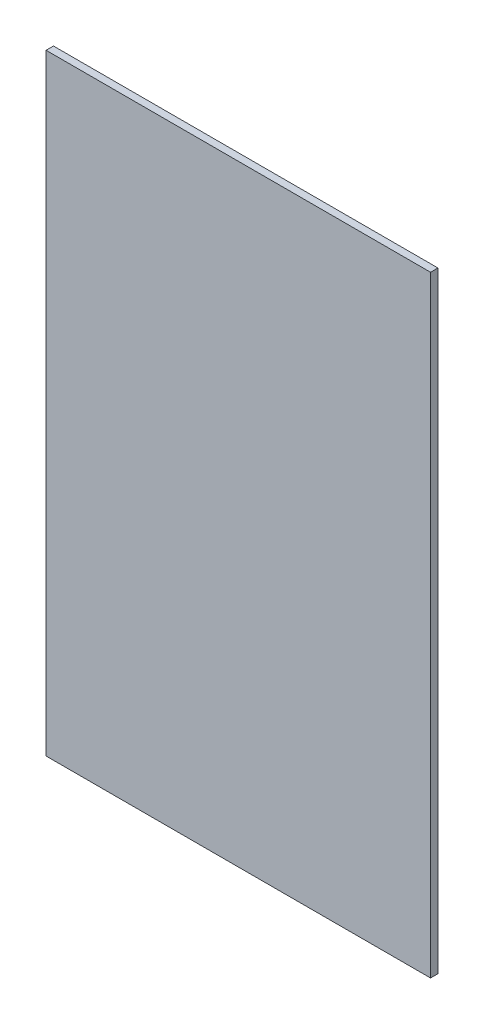
ISO-10303-21;
HEADER;
FILE_DESCRIPTION(('STEP AP214'),'2;1');
FILE_NAME('part.step','',(''),(''),'','','');
FILE_SCHEMA(('AUTOMOTIVE_DESIGN { 1 0 10303 214 1 1 1 1 }'));
ENDSEC;
DATA;
#1=APPLICATION_CONTEXT('core data for automotive mechanical design processes');
#2=APPLICATION_PROTOCOL_DEFINITION('international standard','automotive_design',2000,#1);
#3=PRODUCT_CONTEXT('',#1,'mechanical');
#4=PRODUCT('Part','Part','',(#3));
#5=PRODUCT_RELATED_PRODUCT_CATEGORY('part','',(#4));
#6=PRODUCT_DEFINITION_FORMATION('','',#4);
#7=PRODUCT_DEFINITION_CONTEXT('part definition',#1,'design');
#8=PRODUCT_DEFINITION('design','',#6,#7);
#9=PRODUCT_DEFINITION_SHAPE('','',#8);
#10=(LENGTH_UNIT() NAMED_UNIT(*) SI_UNIT(.MILLI.,.METRE.));
#11=(NAMED_UNIT(*) PLANE_ANGLE_UNIT() SI_UNIT($,.RADIAN.));
#12=(NAMED_UNIT(*) SI_UNIT($,.STERADIAN.) SOLID_ANGLE_UNIT());
#13=UNCERTAINTY_MEASURE_WITH_UNIT(LENGTH_MEASURE(1.E-05),#10,'distance_accuracy_value','');
#14=(GEOMETRIC_REPRESENTATION_CONTEXT(3) GLOBAL_UNCERTAINTY_ASSIGNED_CONTEXT((#13)) GLOBAL_UNIT_ASSIGNED_CONTEXT((#10,
#11,#12)) REPRESENTATION_CONTEXT('',''));
#15=CARTESIAN_POINT('',(0.,0.,0.));
#16=DIRECTION('',(0.,0.,1.));
#17=DIRECTION('',(1.,0.,0.));
#18=AXIS2_PLACEMENT_3D('',#15,#16,#17);
#19=CARTESIAN_POINT('',(0.917030567685551,196.493449781659,3.));
#20=DIRECTION('',(1.,0.,0.));
#21=DIRECTION('',(0.,1.,0.));
#22=AXIS2_PLACEMENT_3D('',#19,#20,#21);
#23=PLANE('',#22);
#24=DIRECTION('',(0.,-1.,0.));
#25=VECTOR('',#24,1.);
#26=CARTESIAN_POINT('',(0.917030567685551,196.493449781659,0.));
#27=LINE('',#26,#25);
#28=CARTESIAN_POINT('',(0.917030567685551,196.493449781659,0.));
#29=VERTEX_POINT('',#28);
#30=CARTESIAN_POINT('',(0.917030567685609,-51.5065502183406,0.));
#31=VERTEX_POINT('',#30);
#32=EDGE_CURVE('E98',#29,#31,#27,.T.);
#33=ORIENTED_EDGE('',*,*,#32,.T.);
#34=DIRECTION('',(0.,0.,-1.));
#35=VECTOR('',#34,1.);
#36=CARTESIAN_POINT('',(0.917030567685609,-51.5065502183406,3.));
#37=LINE('',#36,#35);
#38=CARTESIAN_POINT('',(0.917030567685609,-51.5065502183406,3.));
#39=VERTEX_POINT('',#38);
#40=EDGE_CURVE('E11',#39,#31,#37,.T.);
#41=ORIENTED_EDGE('',*,*,#40,.F.);
#42=DIRECTION('',(0.,-1.,0.));
#43=VECTOR('',#42,1.);
#44=CARTESIAN_POINT('',(0.917030567685551,196.493449781659,3.));
#45=LINE('',#44,#43);
#46=CARTESIAN_POINT('',(0.917030567685551,196.493449781659,3.));
#47=VERTEX_POINT('',#46);
#48=EDGE_CURVE('E86',#47,#39,#45,.T.);
#49=ORIENTED_EDGE('',*,*,#48,.F.);
#50=DIRECTION('',(0.,0.,-1.));
#51=VECTOR('',#50,1.);
#52=CARTESIAN_POINT('',(0.917030567685551,196.493449781659,3.));
#53=LINE('',#52,#51);
#54=EDGE_CURVE('E94',#47,#29,#53,.T.);
#55=ORIENTED_EDGE('',*,*,#54,.T.);
#56=EDGE_LOOP('',(#33,#41,#49,#55));
#57=FACE_BOUND('',#56,.T.);
#58=ADVANCED_FACE('F35',(#57),#23,.F.);
#59=CARTESIAN_POINT('',(0.917030567685609,-51.5065502183406,3.));
#60=DIRECTION('',(0.,1.,0.));
#61=DIRECTION('',(0.,0.,1.));
#62=AXIS2_PLACEMENT_3D('',#59,#60,#61);
#63=PLANE('',#62);
#64=DIRECTION('',(1.,0.,0.));
#65=VECTOR('',#64,1.);
#66=CARTESIAN_POINT('',(0.917030567685609,-51.5065502183406,0.));
#67=LINE('',#66,#65);
#68=CARTESIAN_POINT('',(156.917030567686,-51.5065502183406,0.));
#69=VERTEX_POINT('',#68);
#70=EDGE_CURVE('E90',#31,#69,#67,.T.);
#71=ORIENTED_EDGE('',*,*,#70,.T.);
#72=DIRECTION('',(0.,0.,-1.));
#73=VECTOR('',#72,1.);
#74=CARTESIAN_POINT('',(156.917030567686,-51.5065502183406,3.));
#75=LINE('',#74,#73);
#76=CARTESIAN_POINT('',(156.917030567686,-51.5065502183406,3.));
#77=VERTEX_POINT('',#76);
#78=EDGE_CURVE('E43',#77,#69,#75,.T.);
#79=ORIENTED_EDGE('',*,*,#78,.F.);
#80=DIRECTION('',(1.,0.,0.));
#81=VECTOR('',#80,1.);
#82=CARTESIAN_POINT('',(0.917030567685609,-51.5065502183406,3.));
#83=LINE('',#82,#81);
#84=EDGE_CURVE('E81',#39,#77,#83,.T.);
#85=ORIENTED_EDGE('',*,*,#84,.F.);
#86=ORIENTED_EDGE('',*,*,#40,.T.);
#87=EDGE_LOOP('',(#71,#79,#85,#86));
#88=FACE_BOUND('',#87,.T.);
#89=ADVANCED_FACE('F89',(#88),#63,.F.);
#90=CARTESIAN_POINT('',(156.917030567686,196.493449781659,3.));
#91=DIRECTION('',(-1.,0.,0.));
#92=DIRECTION('',(0.,-1.,0.));
#93=AXIS2_PLACEMENT_3D('',#90,#91,#92);
#94=PLANE('',#93);
#95=DIRECTION('',(0.,1.,0.));
#96=VECTOR('',#95,1.);
#97=CARTESIAN_POINT('',(156.917030567686,196.493449781659,0.));
#98=LINE('',#97,#96);
#99=CARTESIAN_POINT('',(156.917030567686,196.493449781659,0.));
#100=VERTEX_POINT('',#99);
#101=EDGE_CURVE('E68',#69,#100,#98,.T.);
#102=ORIENTED_EDGE('',*,*,#101,.T.);
#103=DIRECTION('',(0.,0.,-1.));
#104=VECTOR('',#103,1.);
#105=CARTESIAN_POINT('',(156.917030567686,196.493449781659,3.));
#106=LINE('',#105,#104);
#107=CARTESIAN_POINT('',(156.917030567686,196.493449781659,3.));
#108=VERTEX_POINT('',#107);
#109=EDGE_CURVE('E91',#108,#100,#106,.T.);
#110=ORIENTED_EDGE('',*,*,#109,.F.);
#111=DIRECTION('',(0.,1.,0.));
#112=VECTOR('',#111,1.);
#113=CARTESIAN_POINT('',(156.917030567686,196.493449781659,3.));
#114=LINE('',#113,#112);
#115=EDGE_CURVE('E84',#77,#108,#114,.T.);
#116=ORIENTED_EDGE('',*,*,#115,.F.);
#117=ORIENTED_EDGE('',*,*,#78,.T.);
#118=EDGE_LOOP('',(#102,#110,#116,#117));
#119=FACE_BOUND('',#118,.T.);
#120=ADVANCED_FACE('F92',(#119),#94,.F.);
#121=CARTESIAN_POINT('',(0.917030567685551,196.493449781659,3.));
#122=DIRECTION('',(0.,-1.,0.));
#123=DIRECTION('',(0.,0.,-1.));
#124=AXIS2_PLACEMENT_3D('',#121,#122,#123);
#125=PLANE('',#124);
#126=DIRECTION('',(-1.,0.,0.));
#127=VECTOR('',#126,1.);
#128=CARTESIAN_POINT('',(0.917030567685551,196.493449781659,0.));
#129=LINE('',#128,#127);
#130=EDGE_CURVE('E74',#100,#29,#129,.T.);
#131=ORIENTED_EDGE('',*,*,#130,.T.);
#132=ORIENTED_EDGE('',*,*,#54,.F.);
#133=DIRECTION('',(-1.,0.,0.));
#134=VECTOR('',#133,1.);
#135=CARTESIAN_POINT('',(0.917030567685551,196.493449781659,3.));
#136=LINE('',#135,#134);
#137=EDGE_CURVE('E51',#108,#47,#136,.T.);
#138=ORIENTED_EDGE('',*,*,#137,.F.);
#139=ORIENTED_EDGE('',*,*,#109,.T.);
#140=EDGE_LOOP('',(#131,#132,#138,#139));
#141=FACE_BOUND('',#140,.T.);
#142=ADVANCED_FACE('F105',(#141),#125,.F.);
#143=CARTESIAN_POINT('',(0.,0.,3.));
#144=DIRECTION('',(0.,0.,1.));
#145=DIRECTION('',(1.,0.,0.));
#146=AXIS2_PLACEMENT_3D('',#143,#144,#145);
#147=PLANE('',#146);
#148=ORIENTED_EDGE('',*,*,#48,.T.);
#149=ORIENTED_EDGE('',*,*,#84,.T.);
#150=ORIENTED_EDGE('',*,*,#115,.T.);
#151=ORIENTED_EDGE('',*,*,#137,.T.);
#152=EDGE_LOOP('',(#148,#149,#150,#151));
#153=FACE_BOUND('',#152,.T.);
#154=ADVANCED_FACE('F82',(#153),#147,.T.);
#155=CARTESIAN_POINT('',(0.,0.,0.));
#156=DIRECTION('',(0.,0.,1.));
#157=DIRECTION('',(1.,0.,0.));
#158=AXIS2_PLACEMENT_3D('',#155,#156,#157);
#159=PLANE('',#158);
#160=ORIENTED_EDGE('',*,*,#32,.F.);
#161=ORIENTED_EDGE('',*,*,#130,.F.);
#162=ORIENTED_EDGE('',*,*,#101,.F.);
#163=ORIENTED_EDGE('',*,*,#70,.F.);
#164=EDGE_LOOP('',(#160,#161,#162,#163));
#165=FACE_BOUND('',#164,.T.);
#166=ADVANCED_FACE('F108',(#165),#159,.F.);
#167=CLOSED_SHELL('',(#58,#89,#120,#142,#154,#166));
#168=MANIFOLD_SOLID_BREP('B2',#167);
#169=ADVANCED_BREP_SHAPE_REPRESENTATION('',(#18,#168),#14);
#170=SHAPE_DEFINITION_REPRESENTATION(#9,#169);
ENDSEC;
END-ISO-10303-21;
